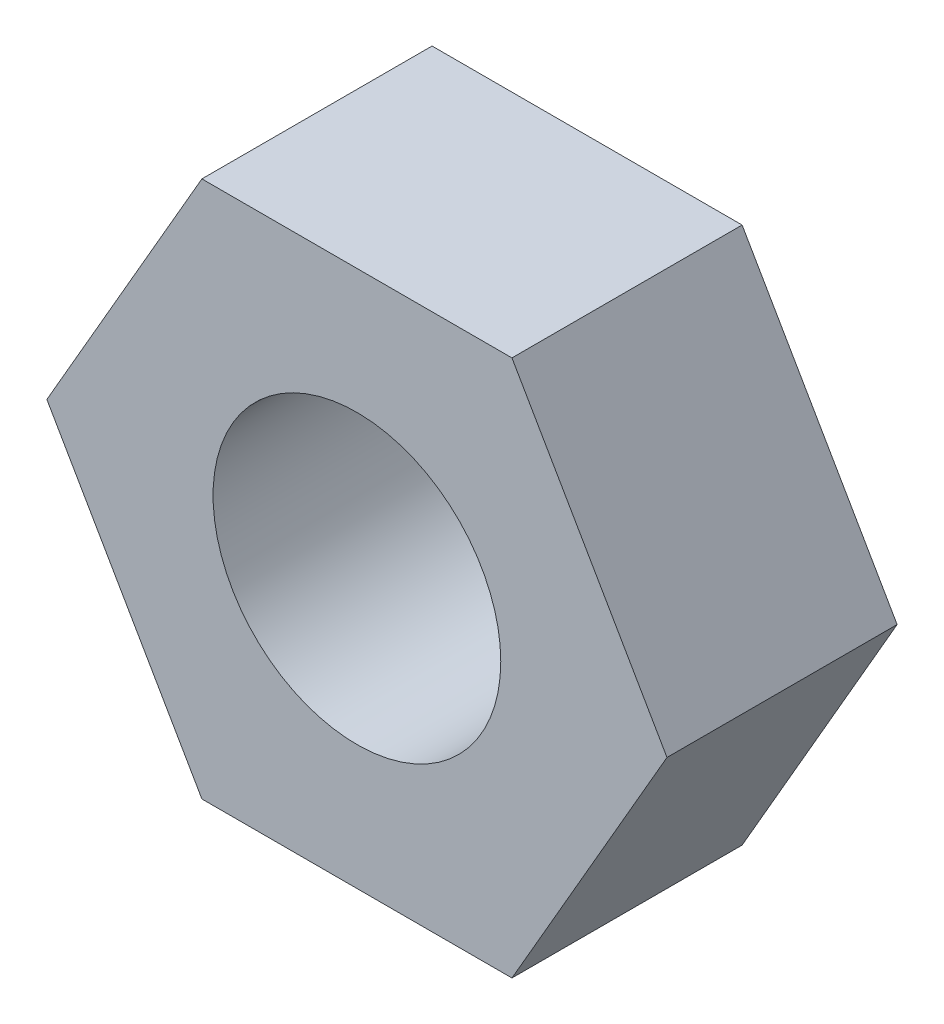
ISO-10303-21;
HEADER;
FILE_DESCRIPTION(('STEP AP214'),'2;1');
FILE_NAME('part.step','',(''),(''),'','','');
FILE_SCHEMA(('AUTOMOTIVE_DESIGN { 1 0 10303 214 1 1 1 1 }'));
ENDSEC;
DATA;
#1=APPLICATION_CONTEXT('core data for automotive mechanical design processes');
#2=APPLICATION_PROTOCOL_DEFINITION('international standard','automotive_design',2000,#1);
#3=PRODUCT_CONTEXT('',#1,'mechanical');
#4=PRODUCT('Part','Part','',(#3));
#5=PRODUCT_RELATED_PRODUCT_CATEGORY('part','',(#4));
#6=PRODUCT_DEFINITION_FORMATION('','',#4);
#7=PRODUCT_DEFINITION_CONTEXT('part definition',#1,'design');
#8=PRODUCT_DEFINITION('design','',#6,#7);
#9=PRODUCT_DEFINITION_SHAPE('','',#8);
#10=(LENGTH_UNIT() NAMED_UNIT(*) SI_UNIT(.MILLI.,.METRE.));
#11=(NAMED_UNIT(*) PLANE_ANGLE_UNIT() SI_UNIT($,.RADIAN.));
#12=(NAMED_UNIT(*) SI_UNIT($,.STERADIAN.) SOLID_ANGLE_UNIT());
#13=UNCERTAINTY_MEASURE_WITH_UNIT(LENGTH_MEASURE(1.E-05),#10,'distance_accuracy_value','');
#14=(GEOMETRIC_REPRESENTATION_CONTEXT(3) GLOBAL_UNCERTAINTY_ASSIGNED_CONTEXT((#13)) GLOBAL_UNIT_ASSIGNED_CONTEXT((#10,
#11,#12)) REPRESENTATION_CONTEXT('',''));
#15=CARTESIAN_POINT('',(0.,0.,0.));
#16=DIRECTION('',(0.,0.,1.));
#17=DIRECTION('',(1.,0.,0.));
#18=AXIS2_PLACEMENT_3D('',#15,#16,#17);
#19=CARTESIAN_POINT('',(0.,0.,-1.));
#20=DIRECTION('',(0.,0.,-1.));
#21=DIRECTION('',(1.,0.,0.));
#22=AXIS2_PLACEMENT_3D('',#19,#20,#21);
#23=CYLINDRICAL_SURFACE('',#22,1.5);
#24=CARTESIAN_POINT('',(0.,0.,0.));
#25=DIRECTION('',(0.,0.,-1.));
#26=DIRECTION('',(1.,0.,0.));
#27=AXIS2_PLACEMENT_3D('',#24,#25,#26);
#28=CIRCLE('',#27,1.5);
#29=CARTESIAN_POINT('',(1.5,0.,0.));
#30=VERTEX_POINT('',#29);
#31=EDGE_CURVE('E90',#30,#30,#28,.T.);
#32=ORIENTED_EDGE('',*,*,#31,.T.);
#33=DIRECTION('',(0.,0.,1.));
#34=VECTOR('',#33,1.);
#35=CARTESIAN_POINT('',(1.5,0.,-1.));
#36=LINE('',#35,#34);
#37=CARTESIAN_POINT('',(1.5,0.,2.4));
#38=VERTEX_POINT('',#37);
#39=EDGE_CURVE('E9',#30,#38,#36,.T.);
#40=ORIENTED_EDGE('',*,*,#39,.T.);
#41=CARTESIAN_POINT('',(0.,0.,2.4));
#42=DIRECTION('',(0.,0.,-1.));
#43=DIRECTION('',(1.,0.,0.));
#44=AXIS2_PLACEMENT_3D('',#41,#42,#43);
#45=CIRCLE('',#44,1.5);
#46=EDGE_CURVE('E91',#38,#38,#45,.T.);
#47=ORIENTED_EDGE('',*,*,#46,.F.);
#48=ORIENTED_EDGE('',*,*,#39,.F.);
#49=EDGE_LOOP('',(#32,#40,#47,#48));
#50=FACE_BOUND('',#49,.T.);
#51=ADVANCED_FACE('F15',(#50),#23,.F.);
#52=CARTESIAN_POINT('',(-3.233161507462,0.,0.));
#53=DIRECTION('',(0.866025403784329,0.50000000000019,0.));
#54=DIRECTION('',(0.,0.,-1.));
#55=AXIS2_PLACEMENT_3D('',#52,#53,#54);
#56=PLANE('',#55);
#57=DIRECTION('',(0.50000000000019,-0.866025403784329,0.));
#58=VECTOR('',#57,1.);
#59=CARTESIAN_POINT('',(-3.233161507462,0.,0.));
#60=LINE('',#59,#58);
#61=CARTESIAN_POINT('',(-3.233161507462,0.,0.));
#62=VERTEX_POINT('',#61);
#63=CARTESIAN_POINT('',(-1.616580753731,-2.8,0.));
#64=VERTEX_POINT('',#63);
#65=EDGE_CURVE('E131',#62,#64,#60,.T.);
#66=ORIENTED_EDGE('',*,*,#65,.T.);
#67=DIRECTION('',(0.,0.,1.));
#68=VECTOR('',#67,1.);
#69=CARTESIAN_POINT('',(-1.616580753731,-2.8,0.));
#70=LINE('',#69,#68);
#71=CARTESIAN_POINT('',(-1.616580753731,-2.8,2.4));
#72=VERTEX_POINT('',#71);
#73=EDGE_CURVE('E46',#64,#72,#70,.T.);
#74=ORIENTED_EDGE('',*,*,#73,.T.);
#75=DIRECTION('',(0.50000000000019,-0.866025403784329,0.));
#76=VECTOR('',#75,1.);
#77=CARTESIAN_POINT('',(-3.233161507462,0.,2.4));
#78=LINE('',#77,#76);
#79=CARTESIAN_POINT('',(-3.233161507462,0.,2.4));
#80=VERTEX_POINT('',#79);
#81=EDGE_CURVE('E101',#80,#72,#78,.T.);
#82=ORIENTED_EDGE('',*,*,#81,.F.);
#83=DIRECTION('',(0.,0.,1.));
#84=VECTOR('',#83,1.);
#85=CARTESIAN_POINT('',(-3.233161507462,0.,0.));
#86=LINE('',#85,#84);
#87=EDGE_CURVE('E23',#62,#80,#86,.T.);
#88=ORIENTED_EDGE('',*,*,#87,.F.);
#89=EDGE_LOOP('',(#66,#74,#82,#88));
#90=FACE_BOUND('',#89,.T.);
#91=ADVANCED_FACE('F117',(#90),#56,.F.);
#92=CARTESIAN_POINT('',(-1.616580753731,2.8,0.));
#93=DIRECTION('',(0.866025403784329,-0.50000000000019,0.));
#94=DIRECTION('',(0.,0.,-1.));
#95=AXIS2_PLACEMENT_3D('',#92,#93,#94);
#96=PLANE('',#95);
#97=DIRECTION('',(-0.50000000000019,-0.866025403784329,0.));
#98=VECTOR('',#97,1.);
#99=CARTESIAN_POINT('',(-1.616580753731,2.8,0.));
#100=LINE('',#99,#98);
#101=CARTESIAN_POINT('',(-1.616580753731,2.8,0.));
#102=VERTEX_POINT('',#101);
#103=EDGE_CURVE('E114',#102,#62,#100,.T.);
#104=ORIENTED_EDGE('',*,*,#103,.T.);
#105=ORIENTED_EDGE('',*,*,#87,.T.);
#106=DIRECTION('',(-0.50000000000019,-0.866025403784329,0.));
#107=VECTOR('',#106,1.);
#108=CARTESIAN_POINT('',(-1.616580753731,2.8,2.4));
#109=LINE('',#108,#107);
#110=CARTESIAN_POINT('',(-1.616580753731,2.8,2.4));
#111=VERTEX_POINT('',#110);
#112=EDGE_CURVE('E112',#111,#80,#109,.T.);
#113=ORIENTED_EDGE('',*,*,#112,.F.);
#114=DIRECTION('',(0.,0.,1.));
#115=VECTOR('',#114,1.);
#116=CARTESIAN_POINT('',(-1.616580753731,2.8,0.));
#117=LINE('',#116,#115);
#118=EDGE_CURVE('E144',#102,#111,#117,.T.);
#119=ORIENTED_EDGE('',*,*,#118,.F.);
#120=EDGE_LOOP('',(#104,#105,#113,#119));
#121=FACE_BOUND('',#120,.T.);
#122=ADVANCED_FACE('F109',(#121),#96,.F.);
#123=CARTESIAN_POINT('',(-1.616580753731,-2.8,0.));
#124=DIRECTION('',(0.,1.,0.));
#125=DIRECTION('',(1.,0.,0.));
#126=AXIS2_PLACEMENT_3D('',#123,#124,#125);
#127=PLANE('',#126);
#128=DIRECTION('',(1.,0.,0.));
#129=VECTOR('',#128,1.);
#130=CARTESIAN_POINT('',(-1.616580753731,-2.8,0.));
#131=LINE('',#130,#129);
#132=CARTESIAN_POINT('',(1.616580753731,-2.8,0.));
#133=VERTEX_POINT('',#132);
#134=EDGE_CURVE('E134',#64,#133,#131,.T.);
#135=ORIENTED_EDGE('',*,*,#134,.T.);
#136=DIRECTION('',(0.,0.,1.));
#137=VECTOR('',#136,1.);
#138=CARTESIAN_POINT('',(1.616580753731,-2.8,0.));
#139=LINE('',#138,#137);
#140=CARTESIAN_POINT('',(1.616580753731,-2.8,2.4));
#141=VERTEX_POINT('',#140);
#142=EDGE_CURVE('E151',#133,#141,#139,.T.);
#143=ORIENTED_EDGE('',*,*,#142,.T.);
#144=DIRECTION('',(1.,0.,0.));
#145=VECTOR('',#144,1.);
#146=CARTESIAN_POINT('',(-1.616580753731,-2.8,2.4));
#147=LINE('',#146,#145);
#148=EDGE_CURVE('E94',#72,#141,#147,.T.);
#149=ORIENTED_EDGE('',*,*,#148,.F.);
#150=ORIENTED_EDGE('',*,*,#73,.F.);
#151=EDGE_LOOP('',(#135,#143,#149,#150));
#152=FACE_BOUND('',#151,.T.);
#153=ADVANCED_FACE('F191',(#152),#127,.F.);
#154=CARTESIAN_POINT('',(0.,0.,2.4));
#155=DIRECTION('',(0.,0.,1.));
#156=DIRECTION('',(1.,0.,0.));
#157=AXIS2_PLACEMENT_3D('',#154,#155,#156);
#158=PLANE('',#157);
#159=ORIENTED_EDGE('',*,*,#46,.T.);
#160=EDGE_LOOP('',(#159));
#161=FACE_BOUND('',#160,.T.);
#162=DIRECTION('',(-0.50000000000019,0.866025403784329,0.));
#163=VECTOR('',#162,1.);
#164=CARTESIAN_POINT('',(3.233161507462,0.,2.4));
#165=LINE('',#164,#163);
#166=CARTESIAN_POINT('',(3.233161507462,0.,2.4));
#167=VERTEX_POINT('',#166);
#168=CARTESIAN_POINT('',(1.616580753731,2.8,2.4));
#169=VERTEX_POINT('',#168);
#170=EDGE_CURVE('E164',#167,#169,#165,.T.);
#171=ORIENTED_EDGE('',*,*,#170,.T.);
#172=DIRECTION('',(-1.,0.,0.));
#173=VECTOR('',#172,1.);
#174=CARTESIAN_POINT('',(1.616580753731,2.8,2.4));
#175=LINE('',#174,#173);
#176=EDGE_CURVE('E123',#169,#111,#175,.T.);
#177=ORIENTED_EDGE('',*,*,#176,.T.);
#178=ORIENTED_EDGE('',*,*,#112,.T.);
#179=ORIENTED_EDGE('',*,*,#81,.T.);
#180=ORIENTED_EDGE('',*,*,#148,.T.);
#181=DIRECTION('',(0.50000000000019,0.866025403784329,0.));
#182=VECTOR('',#181,1.);
#183=CARTESIAN_POINT('',(1.616580753731,-2.8,2.4));
#184=LINE('',#183,#182);
#185=EDGE_CURVE('E155',#141,#167,#184,.T.);
#186=ORIENTED_EDGE('',*,*,#185,.T.);
#187=EDGE_LOOP('',(#171,#177,#178,#179,#180,#186));
#188=FACE_BOUND('',#187,.T.);
#189=ADVANCED_FACE('F122',(#161,#188),#158,.T.);
#190=CARTESIAN_POINT('',(0.,0.,0.));
#191=DIRECTION('',(0.,0.,1.));
#192=DIRECTION('',(1.,0.,0.));
#193=AXIS2_PLACEMENT_3D('',#190,#191,#192);
#194=PLANE('',#193);
#195=ORIENTED_EDGE('',*,*,#31,.F.);
#196=EDGE_LOOP('',(#195));
#197=FACE_BOUND('',#196,.T.);
#198=DIRECTION('',(0.50000000000019,0.866025403784329,0.));
#199=VECTOR('',#198,1.);
#200=CARTESIAN_POINT('',(1.616580753731,-2.8,0.));
#201=LINE('',#200,#199);
#202=CARTESIAN_POINT('',(3.233161507462,0.,0.));
#203=VERTEX_POINT('',#202);
#204=EDGE_CURVE('E156',#133,#203,#201,.T.);
#205=ORIENTED_EDGE('',*,*,#204,.F.);
#206=ORIENTED_EDGE('',*,*,#134,.F.);
#207=ORIENTED_EDGE('',*,*,#65,.F.);
#208=ORIENTED_EDGE('',*,*,#103,.F.);
#209=DIRECTION('',(-1.,0.,0.));
#210=VECTOR('',#209,1.);
#211=CARTESIAN_POINT('',(1.616580753731,2.8,0.));
#212=LINE('',#211,#210);
#213=CARTESIAN_POINT('',(1.616580753731,2.8,0.));
#214=VERTEX_POINT('',#213);
#215=EDGE_CURVE('E147',#214,#102,#212,.T.);
#216=ORIENTED_EDGE('',*,*,#215,.F.);
#217=DIRECTION('',(-0.50000000000019,0.866025403784329,0.));
#218=VECTOR('',#217,1.);
#219=CARTESIAN_POINT('',(3.233161507462,0.,0.));
#220=LINE('',#219,#218);
#221=EDGE_CURVE('E173',#203,#214,#220,.T.);
#222=ORIENTED_EDGE('',*,*,#221,.F.);
#223=EDGE_LOOP('',(#205,#206,#207,#208,#216,#222));
#224=FACE_BOUND('',#223,.T.);
#225=ADVANCED_FACE('F185',(#197,#224),#194,.F.);
#226=CARTESIAN_POINT('',(1.616580753731,2.8,0.));
#227=DIRECTION('',(0.,-1.,0.));
#228=DIRECTION('',(-1.,0.,0.));
#229=AXIS2_PLACEMENT_3D('',#226,#227,#228);
#230=PLANE('',#229);
#231=ORIENTED_EDGE('',*,*,#215,.T.);
#232=ORIENTED_EDGE('',*,*,#118,.T.);
#233=ORIENTED_EDGE('',*,*,#176,.F.);
#234=DIRECTION('',(0.,0.,1.));
#235=VECTOR('',#234,1.);
#236=CARTESIAN_POINT('',(1.616580753731,2.8,0.));
#237=LINE('',#236,#235);
#238=EDGE_CURVE('E169',#214,#169,#237,.T.);
#239=ORIENTED_EDGE('',*,*,#238,.F.);
#240=EDGE_LOOP('',(#231,#232,#233,#239));
#241=FACE_BOUND('',#240,.T.);
#242=ADVANCED_FACE('F238',(#241),#230,.F.);
#243=CARTESIAN_POINT('',(1.616580753731,-2.8,0.));
#244=DIRECTION('',(-0.866025403784329,0.50000000000019,0.));
#245=DIRECTION('',(0.,0.,1.));
#246=AXIS2_PLACEMENT_3D('',#243,#244,#245);
#247=PLANE('',#246);
#248=ORIENTED_EDGE('',*,*,#204,.T.);
#249=DIRECTION('',(0.,0.,1.));
#250=VECTOR('',#249,1.);
#251=CARTESIAN_POINT('',(3.233161507462,0.,0.));
#252=LINE('',#251,#250);
#253=EDGE_CURVE('E159',#203,#167,#252,.T.);
#254=ORIENTED_EDGE('',*,*,#253,.T.);
#255=ORIENTED_EDGE('',*,*,#185,.F.);
#256=ORIENTED_EDGE('',*,*,#142,.F.);
#257=EDGE_LOOP('',(#248,#254,#255,#256));
#258=FACE_BOUND('',#257,.T.);
#259=ADVANCED_FACE('F189',(#258),#247,.F.);
#260=CARTESIAN_POINT('',(3.233161507462,0.,0.));
#261=DIRECTION('',(-0.866025403784329,-0.50000000000019,0.));
#262=DIRECTION('',(-0.50000000000019,0.866025403784329,0.));
#263=AXIS2_PLACEMENT_3D('',#260,#261,#262);
#264=PLANE('',#263);
#265=ORIENTED_EDGE('',*,*,#221,.T.);
#266=ORIENTED_EDGE('',*,*,#238,.T.);
#267=ORIENTED_EDGE('',*,*,#170,.F.);
#268=ORIENTED_EDGE('',*,*,#253,.F.);
#269=EDGE_LOOP('',(#265,#266,#267,#268));
#270=FACE_BOUND('',#269,.T.);
#271=ADVANCED_FACE('F180',(#270),#264,.F.);
#272=CLOSED_SHELL('',(#51,#91,#122,#153,#189,#225,#242,#259,#271));
#273=MANIFOLD_SOLID_BREP('B1',#272);
#274=ADVANCED_BREP_SHAPE_REPRESENTATION('',(#18,#273),#14);
#275=SHAPE_DEFINITION_REPRESENTATION(#9,#274);
ENDSEC;
END-ISO-10303-21;
